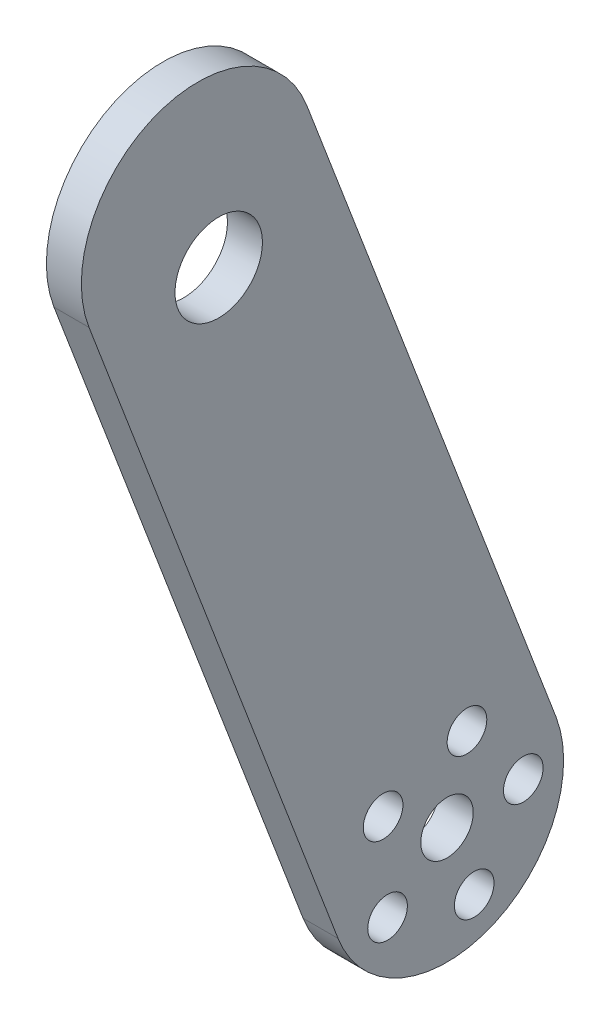
ISO-10303-21;
HEADER;
FILE_DESCRIPTION(('STEP AP214'),'2;1');
FILE_NAME('part.step','',(''),(''),'','','');
FILE_SCHEMA(('AUTOMOTIVE_DESIGN { 1 0 10303 214 1 1 1 1 }'));
ENDSEC;
DATA;
#1=APPLICATION_CONTEXT('core data for automotive mechanical design processes');
#2=APPLICATION_PROTOCOL_DEFINITION('international standard','automotive_design',2000,#1);
#3=PRODUCT_CONTEXT('',#1,'mechanical');
#4=PRODUCT('Part','Part','',(#3));
#5=PRODUCT_RELATED_PRODUCT_CATEGORY('part','',(#4));
#6=PRODUCT_DEFINITION_FORMATION('','',#4);
#7=PRODUCT_DEFINITION_CONTEXT('part definition',#1,'design');
#8=PRODUCT_DEFINITION('design','',#6,#7);
#9=PRODUCT_DEFINITION_SHAPE('','',#8);
#10=(LENGTH_UNIT() NAMED_UNIT(*) SI_UNIT(.MILLI.,.METRE.));
#11=(NAMED_UNIT(*) PLANE_ANGLE_UNIT() SI_UNIT($,.RADIAN.));
#12=(NAMED_UNIT(*) SI_UNIT($,.STERADIAN.) SOLID_ANGLE_UNIT());
#13=UNCERTAINTY_MEASURE_WITH_UNIT(LENGTH_MEASURE(1.E-05),#10,'distance_accuracy_value','');
#14=(GEOMETRIC_REPRESENTATION_CONTEXT(3) GLOBAL_UNCERTAINTY_ASSIGNED_CONTEXT((#13)) GLOBAL_UNIT_ASSIGNED_CONTEXT((#10,
#11,#12)) REPRESENTATION_CONTEXT('',''));
#15=CARTESIAN_POINT('',(0.,0.,0.));
#16=DIRECTION('',(0.,0.,1.));
#17=DIRECTION('',(1.,0.,0.));
#18=AXIS2_PLACEMENT_3D('',#15,#16,#17);
#19=CARTESIAN_POINT('',(0.,15.4,100.));
#20=DIRECTION('',(1.,0.,0.));
#21=DIRECTION('',(0.,0.,-1.));
#22=AXIS2_PLACEMENT_3D('',#19,#20,#21);
#23=PLANE('',#22);
#24=CARTESIAN_POINT('',(0.,15.4,100.));
#25=DIRECTION('',(1.,0.,0.));
#26=DIRECTION('',(0.,0.,-1.));
#27=AXIS2_PLACEMENT_3D('',#24,#25,#26);
#28=CIRCLE('',#27,9.99999999999998);
#29=CARTESIAN_POINT('',(0.,11.8397435918112,109.3447618647));
#30=VERTEX_POINT('',#29);
#31=CARTESIAN_POINT('',(0.,18.9602564081888,90.6552381353001));
#32=VERTEX_POINT('',#31);
#33=EDGE_CURVE('E110',#30,#32,#28,.T.);
#34=ORIENTED_EDGE('',*,*,#33,.F.);
#35=DIRECTION('',(0.,-0.934476186469995,-0.356025640818882));
#36=VECTOR('',#35,1.);
#37=CARTESIAN_POINT('',(0.,11.8397435918112,109.3447618647));
#38=LINE('',#37,#36);
#39=CARTESIAN_POINT('',(0.,67.9083147800111,130.706300313833));
#40=VERTEX_POINT('',#39);
#41=EDGE_CURVE('E80',#40,#30,#38,.T.);
#42=ORIENTED_EDGE('',*,*,#41,.F.);
#43=CARTESIAN_POINT('',(0.,71.4685711881998,121.361538449133));
#44=DIRECTION('',(1.,0.,0.));
#45=DIRECTION('',(0.,0.,-1.));
#46=AXIS2_PLACEMENT_3D('',#43,#44,#45);
#47=CIRCLE('',#46,10.0000000000001);
#48=CARTESIAN_POINT('',(0.,75.0288275963886,112.016776584433));
#49=VERTEX_POINT('',#48);
#50=EDGE_CURVE('E74',#49,#40,#47,.T.);
#51=ORIENTED_EDGE('',*,*,#50,.F.);
#52=DIRECTION('',(0.,0.934476186469996,0.356025640818878));
#53=VECTOR('',#52,1.);
#54=CARTESIAN_POINT('',(0.,18.9602564081888,90.6552381353001));
#55=LINE('',#54,#53);
#56=EDGE_CURVE('E98',#32,#49,#55,.T.);
#57=ORIENTED_EDGE('',*,*,#56,.F.);
#58=EDGE_LOOP('',(#34,#42,#51,#57));
#59=FACE_BOUND('',#58,.T.);
#60=CARTESIAN_POINT('',(0.,66.7961902558498,119.581410245038));
#61=DIRECTION('',(1.,0.,0.));
#62=DIRECTION('',(0.,0.,-1.));
#63=AXIS2_PLACEMENT_3D('',#60,#61,#62);
#64=CIRCLE('',#63,3.75000000000001);
#65=CARTESIAN_POINT('',(0.,66.7961902558498,115.831410245038));
#66=VERTEX_POINT('',#65);
#67=EDGE_CURVE('E133',#66,#66,#64,.T.);
#68=ORIENTED_EDGE('',*,*,#67,.T.);
#69=EDGE_LOOP('',(#68));
#70=FACE_BOUND('',#69,.T.);
#71=CARTESIAN_POINT('',(0.,21.7225429760678,98.2888745470374));
#72=DIRECTION('',(-1.,0.,0.));
#73=DIRECTION('',(0.,0.,1.));
#74=AXIS2_PLACEMENT_3D('',#71,#72,#73);
#75=CIRCLE('',#74,1.7);
#76=CARTESIAN_POINT('',(0.,21.7225429760678,99.9888745470374));
#77=VERTEX_POINT('',#76);
#78=EDGE_CURVE('E144',#77,#77,#75,.T.);
#79=ORIENTED_EDGE('',*,*,#78,.F.);
#80=EDGE_LOOP('',(#79));
#81=FACE_BOUND('',#80,.T.);
#82=CARTESIAN_POINT('',(0.,15.7263962150323,93.4581374585816));
#83=DIRECTION('',(-1.,0.,0.));
#84=DIRECTION('',(0.,0.,1.));
#85=AXIS2_PLACEMENT_3D('',#82,#83,#84);
#86=CIRCLE('',#85,1.7);
#87=CARTESIAN_POINT('',(0.,15.7263962150323,95.1581374585816));
#88=VERTEX_POINT('',#87);
#89=EDGE_CURVE('E152',#88,#88,#86,.T.);
#90=ORIENTED_EDGE('',*,*,#89,.F.);
#91=EDGE_LOOP('',(#90));
#92=FACE_BOUND('',#91,.T.);
#93=CARTESIAN_POINT('',(0.,9.27918097862153,97.6680320526363));
#94=DIRECTION('',(-1.,0.,0.));
#95=DIRECTION('',(0.,0.,1.));
#96=AXIS2_PLACEMENT_3D('',#93,#94,#95);
#97=CIRCLE('',#96,1.7);
#98=CARTESIAN_POINT('',(0.,9.27918097862153,99.3680320526363));
#99=VERTEX_POINT('',#98);
#100=EDGE_CURVE('E160',#99,#99,#97,.T.);
#101=ORIENTED_EDGE('',*,*,#100,.F.);
#102=EDGE_LOOP('',(#101));
#103=FACE_BOUND('',#102,.T.);
#104=CARTESIAN_POINT('',(0.,11.290729590769,105.100627089272));
#105=DIRECTION('',(-1.,0.,0.));
#106=DIRECTION('',(0.,0.,1.));
#107=AXIS2_PLACEMENT_3D('',#104,#105,#106);
#108=CIRCLE('',#107,1.7);
#109=CARTESIAN_POINT('',(0.,11.290729590769,106.800627089272));
#110=VERTEX_POINT('',#109);
#111=EDGE_CURVE('E168',#110,#110,#108,.T.);
#112=ORIENTED_EDGE('',*,*,#111,.F.);
#113=EDGE_LOOP('',(#112));
#114=FACE_BOUND('',#113,.T.);
#115=CARTESIAN_POINT('',(0.,18.9811502395095,105.484328852472));
#116=DIRECTION('',(-1.,0.,0.));
#117=DIRECTION('',(0.,0.,1.));
#118=AXIS2_PLACEMENT_3D('',#115,#116,#117);
#119=CIRCLE('',#118,1.7);
#120=CARTESIAN_POINT('',(0.,18.9811502395095,107.184328852472));
#121=VERTEX_POINT('',#120);
#122=EDGE_CURVE('E176',#121,#121,#119,.T.);
#123=ORIENTED_EDGE('',*,*,#122,.F.);
#124=EDGE_LOOP('',(#123));
#125=FACE_BOUND('',#124,.T.);
#126=CARTESIAN_POINT('',(0.,15.4,100.));
#127=DIRECTION('',(-1.,0.,0.));
#128=DIRECTION('',(0.,0.,1.));
#129=AXIS2_PLACEMENT_3D('',#126,#127,#128);
#130=CIRCLE('',#129,2.25);
#131=CARTESIAN_POINT('',(0.,15.4,102.25));
#132=VERTEX_POINT('',#131);
#133=EDGE_CURVE('E184',#132,#132,#130,.T.);
#134=ORIENTED_EDGE('',*,*,#133,.F.);
#135=EDGE_LOOP('',(#134));
#136=FACE_BOUND('',#135,.T.);
#137=ADVANCED_FACE('F39',(#59,#70,#81,#92,#103,#114,#125,#136),#23,.F.);
#138=CARTESIAN_POINT('',(3.,15.4,100.));
#139=DIRECTION('',(1.,0.,0.));
#140=DIRECTION('',(0.,0.,-1.));
#141=AXIS2_PLACEMENT_3D('',#138,#139,#140);
#142=PLANE('',#141);
#143=CARTESIAN_POINT('',(3.,15.4,100.));
#144=DIRECTION('',(1.,0.,0.));
#145=DIRECTION('',(0.,0.,-1.));
#146=AXIS2_PLACEMENT_3D('',#143,#144,#145);
#147=CIRCLE('',#146,2.25);
#148=CARTESIAN_POINT('',(3.,15.4,97.75));
#149=VERTEX_POINT('',#148);
#150=EDGE_CURVE('E180',#149,#149,#147,.T.);
#151=ORIENTED_EDGE('',*,*,#150,.F.);
#152=EDGE_LOOP('',(#151));
#153=FACE_BOUND('',#152,.T.);
#154=CARTESIAN_POINT('',(3.,18.9811502395095,105.484328852472));
#155=DIRECTION('',(1.,0.,0.));
#156=DIRECTION('',(0.,0.,-1.));
#157=AXIS2_PLACEMENT_3D('',#154,#155,#156);
#158=CIRCLE('',#157,1.7);
#159=CARTESIAN_POINT('',(3.,18.9811502395095,103.784328852472));
#160=VERTEX_POINT('',#159);
#161=EDGE_CURVE('E172',#160,#160,#158,.T.);
#162=ORIENTED_EDGE('',*,*,#161,.F.);
#163=EDGE_LOOP('',(#162));
#164=FACE_BOUND('',#163,.T.);
#165=CARTESIAN_POINT('',(3.,11.290729590769,105.100627089272));
#166=DIRECTION('',(1.,0.,0.));
#167=DIRECTION('',(0.,0.,-1.));
#168=AXIS2_PLACEMENT_3D('',#165,#166,#167);
#169=CIRCLE('',#168,1.7);
#170=CARTESIAN_POINT('',(3.,11.290729590769,103.400627089272));
#171=VERTEX_POINT('',#170);
#172=EDGE_CURVE('E164',#171,#171,#169,.T.);
#173=ORIENTED_EDGE('',*,*,#172,.F.);
#174=EDGE_LOOP('',(#173));
#175=FACE_BOUND('',#174,.T.);
#176=CARTESIAN_POINT('',(3.,9.27918097862153,97.6680320526363));
#177=DIRECTION('',(1.,0.,0.));
#178=DIRECTION('',(0.,0.,-1.));
#179=AXIS2_PLACEMENT_3D('',#176,#177,#178);
#180=CIRCLE('',#179,1.7);
#181=CARTESIAN_POINT('',(3.,9.27918097862153,95.9680320526363));
#182=VERTEX_POINT('',#181);
#183=EDGE_CURVE('E156',#182,#182,#180,.T.);
#184=ORIENTED_EDGE('',*,*,#183,.F.);
#185=EDGE_LOOP('',(#184));
#186=FACE_BOUND('',#185,.T.);
#187=CARTESIAN_POINT('',(3.,15.7263962150323,93.4581374585816));
#188=DIRECTION('',(1.,0.,0.));
#189=DIRECTION('',(0.,0.,-1.));
#190=AXIS2_PLACEMENT_3D('',#187,#188,#189);
#191=CIRCLE('',#190,1.7);
#192=CARTESIAN_POINT('',(3.,15.7263962150323,91.7581374585816));
#193=VERTEX_POINT('',#192);
#194=EDGE_CURVE('E148',#193,#193,#191,.T.);
#195=ORIENTED_EDGE('',*,*,#194,.F.);
#196=EDGE_LOOP('',(#195));
#197=FACE_BOUND('',#196,.T.);
#198=CARTESIAN_POINT('',(3.,21.7225429760678,98.2888745470374));
#199=DIRECTION('',(1.,0.,0.));
#200=DIRECTION('',(0.,0.,-1.));
#201=AXIS2_PLACEMENT_3D('',#198,#199,#200);
#202=CIRCLE('',#201,1.7);
#203=CARTESIAN_POINT('',(3.,21.7225429760678,96.5888745470374));
#204=VERTEX_POINT('',#203);
#205=EDGE_CURVE('E137',#204,#204,#202,.T.);
#206=ORIENTED_EDGE('',*,*,#205,.F.);
#207=EDGE_LOOP('',(#206));
#208=FACE_BOUND('',#207,.T.);
#209=CARTESIAN_POINT('',(3.,15.4,100.));
#210=DIRECTION('',(1.,0.,0.));
#211=DIRECTION('',(0.,0.,-1.));
#212=AXIS2_PLACEMENT_3D('',#209,#210,#211);
#213=CIRCLE('',#212,9.99999999999998);
#214=CARTESIAN_POINT('',(3.,11.8397435918112,109.3447618647));
#215=VERTEX_POINT('',#214);
#216=CARTESIAN_POINT('',(3.,18.9602564081888,90.6552381353001));
#217=VERTEX_POINT('',#216);
#218=EDGE_CURVE('E93',#215,#217,#213,.T.);
#219=ORIENTED_EDGE('',*,*,#218,.T.);
#220=DIRECTION('',(0.,0.934476186469996,0.356025640818878));
#221=VECTOR('',#220,1.);
#222=CARTESIAN_POINT('',(3.,18.9602564081888,90.6552381353001));
#223=LINE('',#222,#221);
#224=CARTESIAN_POINT('',(3.,75.0288275963886,112.016776584433));
#225=VERTEX_POINT('',#224);
#226=EDGE_CURVE('E87',#217,#225,#223,.T.);
#227=ORIENTED_EDGE('',*,*,#226,.T.);
#228=CARTESIAN_POINT('',(3.,71.4685711881998,121.361538449133));
#229=DIRECTION('',(1.,0.,0.));
#230=DIRECTION('',(0.,0.,-1.));
#231=AXIS2_PLACEMENT_3D('',#228,#229,#230);
#232=CIRCLE('',#231,10.0000000000001);
#233=CARTESIAN_POINT('',(3.,67.9083147800111,130.706300313833));
#234=VERTEX_POINT('',#233);
#235=EDGE_CURVE('E91',#225,#234,#232,.T.);
#236=ORIENTED_EDGE('',*,*,#235,.T.);
#237=DIRECTION('',(0.,-0.934476186469995,-0.356025640818882));
#238=VECTOR('',#237,1.);
#239=CARTESIAN_POINT('',(3.,11.8397435918112,109.3447618647));
#240=LINE('',#239,#238);
#241=EDGE_CURVE('E57',#234,#215,#240,.T.);
#242=ORIENTED_EDGE('',*,*,#241,.T.);
#243=EDGE_LOOP('',(#219,#227,#236,#242));
#244=FACE_BOUND('',#243,.T.);
#245=CARTESIAN_POINT('',(3.,66.7961902558498,119.581410245038));
#246=DIRECTION('',(1.,0.,0.));
#247=DIRECTION('',(0.,0.,-1.));
#248=AXIS2_PLACEMENT_3D('',#245,#246,#247);
#249=CIRCLE('',#248,3.75000000000001);
#250=CARTESIAN_POINT('',(3.,66.7961902558498,115.831410245038));
#251=VERTEX_POINT('',#250);
#252=EDGE_CURVE('E114',#251,#251,#249,.T.);
#253=ORIENTED_EDGE('',*,*,#252,.F.);
#254=EDGE_LOOP('',(#253));
#255=FACE_BOUND('',#254,.T.);
#256=ADVANCED_FACE('F88',(#153,#164,#175,#186,#197,#208,#244,#255),#142,.T.);
#257=CARTESIAN_POINT('',(3.,15.4,100.));
#258=DIRECTION('',(-1.,0.,0.));
#259=DIRECTION('',(0.,0.,1.));
#260=AXIS2_PLACEMENT_3D('',#257,#258,#259);
#261=CYLINDRICAL_SURFACE('',#260,9.99999999999998);
#262=ORIENTED_EDGE('',*,*,#33,.T.);
#263=DIRECTION('',(-1.,0.,0.));
#264=VECTOR('',#263,1.);
#265=CARTESIAN_POINT('',(3.,18.9602564081888,90.6552381353001));
#266=LINE('',#265,#264);
#267=EDGE_CURVE('E11',#217,#32,#266,.T.);
#268=ORIENTED_EDGE('',*,*,#267,.F.);
#269=ORIENTED_EDGE('',*,*,#218,.F.);
#270=DIRECTION('',(-1.,0.,0.));
#271=VECTOR('',#270,1.);
#272=CARTESIAN_POINT('',(3.,11.8397435918112,109.3447618647));
#273=LINE('',#272,#271);
#274=EDGE_CURVE('E106',#215,#30,#273,.T.);
#275=ORIENTED_EDGE('',*,*,#274,.T.);
#276=EDGE_LOOP('',(#262,#268,#269,#275));
#277=FACE_BOUND('',#276,.T.);
#278=ADVANCED_FACE('F41',(#277),#261,.T.);
#279=CARTESIAN_POINT('',(3.,18.9602564081888,90.6552381353001));
#280=DIRECTION('',(0.,-0.356025640818878,0.934476186469996));
#281=DIRECTION('',(0.,-0.934476186469996,-0.356025640818878));
#282=AXIS2_PLACEMENT_3D('',#279,#280,#281);
#283=PLANE('',#282);
#284=ORIENTED_EDGE('',*,*,#56,.T.);
#285=DIRECTION('',(-1.,0.,0.));
#286=VECTOR('',#285,1.);
#287=CARTESIAN_POINT('',(3.,75.0288275963886,112.016776584433));
#288=LINE('',#287,#286);
#289=EDGE_CURVE('E49',#225,#49,#288,.T.);
#290=ORIENTED_EDGE('',*,*,#289,.F.);
#291=ORIENTED_EDGE('',*,*,#226,.F.);
#292=ORIENTED_EDGE('',*,*,#267,.T.);
#293=EDGE_LOOP('',(#284,#290,#291,#292));
#294=FACE_BOUND('',#293,.T.);
#295=ADVANCED_FACE('F97',(#294),#283,.F.);
#296=CARTESIAN_POINT('',(3.,71.4685711881998,121.361538449133));
#297=DIRECTION('',(-1.,0.,0.));
#298=DIRECTION('',(0.,0.,1.));
#299=AXIS2_PLACEMENT_3D('',#296,#297,#298);
#300=CYLINDRICAL_SURFACE('',#299,10.0000000000001);
#301=ORIENTED_EDGE('',*,*,#50,.T.);
#302=DIRECTION('',(-1.,0.,0.));
#303=VECTOR('',#302,1.);
#304=CARTESIAN_POINT('',(3.,67.9083147800111,130.706300313833));
#305=LINE('',#304,#303);
#306=EDGE_CURVE('E100',#234,#40,#305,.T.);
#307=ORIENTED_EDGE('',*,*,#306,.F.);
#308=ORIENTED_EDGE('',*,*,#235,.F.);
#309=ORIENTED_EDGE('',*,*,#289,.T.);
#310=EDGE_LOOP('',(#301,#307,#308,#309));
#311=FACE_BOUND('',#310,.T.);
#312=ADVANCED_FACE('F101',(#311),#300,.T.);
#313=CARTESIAN_POINT('',(3.,11.8397435918112,109.3447618647));
#314=DIRECTION('',(0.,0.356025640818882,-0.934476186469995));
#315=DIRECTION('',(0.,0.934476186469995,0.356025640818882));
#316=AXIS2_PLACEMENT_3D('',#313,#314,#315);
#317=PLANE('',#316);
#318=ORIENTED_EDGE('',*,*,#41,.T.);
#319=ORIENTED_EDGE('',*,*,#274,.F.);
#320=ORIENTED_EDGE('',*,*,#241,.F.);
#321=ORIENTED_EDGE('',*,*,#306,.T.);
#322=EDGE_LOOP('',(#318,#319,#320,#321));
#323=FACE_BOUND('',#322,.T.);
#324=ADVANCED_FACE('F125',(#323),#317,.F.);
#325=CARTESIAN_POINT('',(3.,66.7961902558498,119.581410245038));
#326=DIRECTION('',(-1.,0.,0.));
#327=DIRECTION('',(0.,0.,1.));
#328=AXIS2_PLACEMENT_3D('',#325,#326,#327);
#329=CYLINDRICAL_SURFACE('',#328,3.75000000000001);
#330=ORIENTED_EDGE('',*,*,#252,.T.);
#331=EDGE_LOOP('',(#330));
#332=FACE_BOUND('',#331,.T.);
#333=ORIENTED_EDGE('',*,*,#67,.F.);
#334=EDGE_LOOP('',(#333));
#335=FACE_BOUND('',#334,.T.);
#336=ADVANCED_FACE('F204',(#332,#335),#329,.F.);
#337=CARTESIAN_POINT('',(0.,21.7225429760678,98.2888745470374));
#338=DIRECTION('',(-1.,0.,0.));
#339=DIRECTION('',(0.,0.,1.));
#340=AXIS2_PLACEMENT_3D('',#337,#338,#339);
#341=CYLINDRICAL_SURFACE('',#340,1.7);
#342=ORIENTED_EDGE('',*,*,#78,.T.);
#343=EDGE_LOOP('',(#342));
#344=FACE_BOUND('',#343,.T.);
#345=ORIENTED_EDGE('',*,*,#205,.T.);
#346=EDGE_LOOP('',(#345));
#347=FACE_BOUND('',#346,.T.);
#348=ADVANCED_FACE('F271',(#344,#347),#341,.F.);
#349=CARTESIAN_POINT('',(0.,15.7263962150323,93.4581374585816));
#350=DIRECTION('',(-1.,0.,0.));
#351=DIRECTION('',(0.,0.,1.));
#352=AXIS2_PLACEMENT_3D('',#349,#350,#351);
#353=CYLINDRICAL_SURFACE('',#352,1.7);
#354=ORIENTED_EDGE('',*,*,#89,.T.);
#355=EDGE_LOOP('',(#354));
#356=FACE_BOUND('',#355,.T.);
#357=ORIENTED_EDGE('',*,*,#194,.T.);
#358=EDGE_LOOP('',(#357));
#359=FACE_BOUND('',#358,.T.);
#360=ADVANCED_FACE('F259',(#356,#359),#353,.F.);
#361=CARTESIAN_POINT('',(0.,9.27918097862153,97.6680320526363));
#362=DIRECTION('',(-1.,0.,0.));
#363=DIRECTION('',(0.,0.,1.));
#364=AXIS2_PLACEMENT_3D('',#361,#362,#363);
#365=CYLINDRICAL_SURFACE('',#364,1.7);
#366=ORIENTED_EDGE('',*,*,#100,.T.);
#367=EDGE_LOOP('',(#366));
#368=FACE_BOUND('',#367,.T.);
#369=ORIENTED_EDGE('',*,*,#183,.T.);
#370=EDGE_LOOP('',(#369));
#371=FACE_BOUND('',#370,.T.);
#372=ADVANCED_FACE('F247',(#368,#371),#365,.F.);
#373=CARTESIAN_POINT('',(0.,11.290729590769,105.100627089272));
#374=DIRECTION('',(-1.,0.,0.));
#375=DIRECTION('',(0.,0.,1.));
#376=AXIS2_PLACEMENT_3D('',#373,#374,#375);
#377=CYLINDRICAL_SURFACE('',#376,1.7);
#378=ORIENTED_EDGE('',*,*,#111,.T.);
#379=EDGE_LOOP('',(#378));
#380=FACE_BOUND('',#379,.T.);
#381=ORIENTED_EDGE('',*,*,#172,.T.);
#382=EDGE_LOOP('',(#381));
#383=FACE_BOUND('',#382,.T.);
#384=ADVANCED_FACE('F235',(#380,#383),#377,.F.);
#385=CARTESIAN_POINT('',(0.,18.9811502395095,105.484328852472));
#386=DIRECTION('',(-1.,0.,0.));
#387=DIRECTION('',(0.,0.,1.));
#388=AXIS2_PLACEMENT_3D('',#385,#386,#387);
#389=CYLINDRICAL_SURFACE('',#388,1.7);
#390=ORIENTED_EDGE('',*,*,#122,.T.);
#391=EDGE_LOOP('',(#390));
#392=FACE_BOUND('',#391,.T.);
#393=ORIENTED_EDGE('',*,*,#161,.T.);
#394=EDGE_LOOP('',(#393));
#395=FACE_BOUND('',#394,.T.);
#396=ADVANCED_FACE('F230',(#392,#395),#389,.F.);
#397=CARTESIAN_POINT('',(0.,15.4,100.));
#398=DIRECTION('',(-1.,0.,0.));
#399=DIRECTION('',(0.,0.,1.));
#400=AXIS2_PLACEMENT_3D('',#397,#398,#399);
#401=CYLINDRICAL_SURFACE('',#400,2.25);
#402=ORIENTED_EDGE('',*,*,#133,.T.);
#403=EDGE_LOOP('',(#402));
#404=FACE_BOUND('',#403,.T.);
#405=ORIENTED_EDGE('',*,*,#150,.T.);
#406=EDGE_LOOP('',(#405));
#407=FACE_BOUND('',#406,.T.);
#408=ADVANCED_FACE('F190',(#404,#407),#401,.F.);
#409=CLOSED_SHELL('',(#137,#256,#278,#295,#312,#324,#336,#348,#360,#372,#384,#396,#408));
#410=MANIFOLD_SOLID_BREP('B2',#409);
#411=ADVANCED_BREP_SHAPE_REPRESENTATION('',(#18,#410),#14);
#412=SHAPE_DEFINITION_REPRESENTATION(#9,#411);
ENDSEC;
END-ISO-10303-21;
